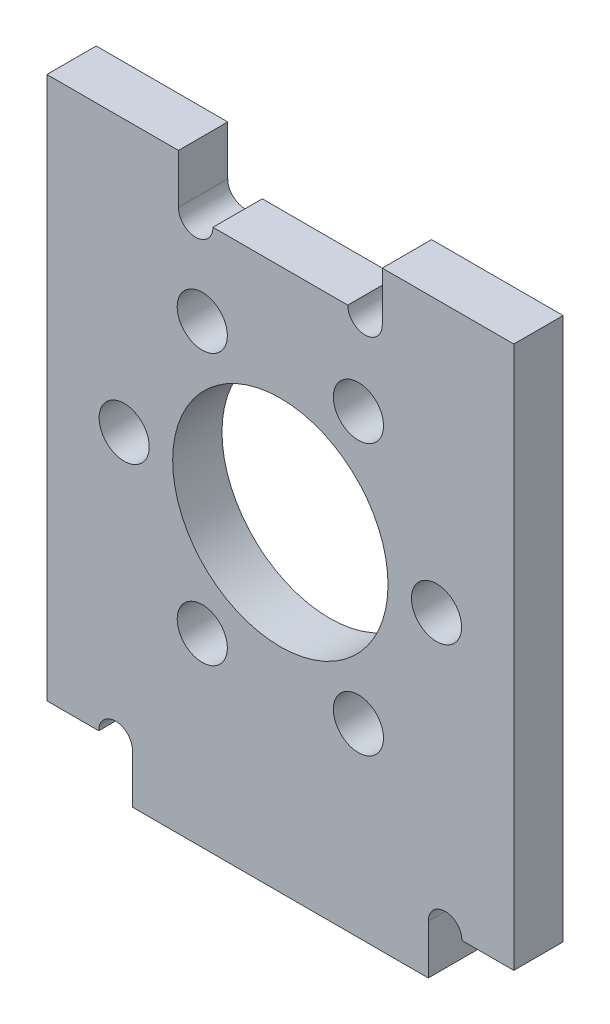
ISO-10303-21;
HEADER;
FILE_DESCRIPTION(('STEP AP214'),'2;1');
FILE_NAME('part.step','',(''),(''),'','','');
FILE_SCHEMA(('AUTOMOTIVE_DESIGN { 1 0 10303 214 1 1 1 1 }'));
ENDSEC;
DATA;
#1=APPLICATION_CONTEXT('core data for automotive mechanical design processes');
#2=APPLICATION_PROTOCOL_DEFINITION('international standard','automotive_design',2000,#1);
#3=PRODUCT_CONTEXT('',#1,'mechanical');
#4=PRODUCT('Part','Part','',(#3));
#5=PRODUCT_RELATED_PRODUCT_CATEGORY('part','',(#4));
#6=PRODUCT_DEFINITION_FORMATION('','',#4);
#7=PRODUCT_DEFINITION_CONTEXT('part definition',#1,'design');
#8=PRODUCT_DEFINITION('design','',#6,#7);
#9=PRODUCT_DEFINITION_SHAPE('','',#8);
#10=(LENGTH_UNIT() NAMED_UNIT(*) SI_UNIT(.MILLI.,.METRE.));
#11=(NAMED_UNIT(*) PLANE_ANGLE_UNIT() SI_UNIT($,.RADIAN.));
#12=(NAMED_UNIT(*) SI_UNIT($,.STERADIAN.) SOLID_ANGLE_UNIT());
#13=UNCERTAINTY_MEASURE_WITH_UNIT(LENGTH_MEASURE(1.E-05),#10,'distance_accuracy_value','');
#14=(GEOMETRIC_REPRESENTATION_CONTEXT(3) GLOBAL_UNCERTAINTY_ASSIGNED_CONTEXT((#13)) GLOBAL_UNIT_ASSIGNED_CONTEXT((#10,
#11,#12)) REPRESENTATION_CONTEXT('',''));
#15=CARTESIAN_POINT('',(0.,0.,0.));
#16=DIRECTION('',(0.,0.,1.));
#17=DIRECTION('',(1.,0.,0.));
#18=AXIS2_PLACEMENT_3D('',#15,#16,#17);
#19=CARTESIAN_POINT('',(-14.2,-15.,3.));
#20=DIRECTION('',(0.,1.,0.));
#21=DIRECTION('',(0.,0.,1.));
#22=AXIS2_PLACEMENT_3D('',#19,#20,#21);
#23=PLANE('',#22);
#24=DIRECTION('',(1.,0.,0.));
#25=VECTOR('',#24,1.);
#26=CARTESIAN_POINT('',(-14.2,-15.,0.));
#27=LINE('',#26,#25);
#28=CARTESIAN_POINT('',(-14.2,-15.,0.));
#29=VERTEX_POINT('',#28);
#30=CARTESIAN_POINT('',(-11.05,-15.,0.));
#31=VERTEX_POINT('',#30);
#32=EDGE_CURVE('E186',#29,#31,#27,.T.);
#33=ORIENTED_EDGE('',*,*,#32,.T.);
#34=DIRECTION('',(0.,0.,-1.));
#35=VECTOR('',#34,1.);
#36=CARTESIAN_POINT('',(-11.05,-15.,5.89913780286485));
#37=LINE('',#36,#35);
#38=CARTESIAN_POINT('',(-11.05,-15.,3.));
#39=VERTEX_POINT('',#38);
#40=EDGE_CURVE('E153',#31,#39,#37,.F.);
#41=ORIENTED_EDGE('',*,*,#40,.T.);
#42=DIRECTION('',(1.,0.,0.));
#43=VECTOR('',#42,1.);
#44=CARTESIAN_POINT('',(-14.2,-15.,3.));
#45=LINE('',#44,#43);
#46=CARTESIAN_POINT('',(-14.2,-15.,3.));
#47=VERTEX_POINT('',#46);
#48=EDGE_CURVE('E170',#47,#39,#45,.T.);
#49=ORIENTED_EDGE('',*,*,#48,.F.);
#50=DIRECTION('',(0.,0.,-1.));
#51=VECTOR('',#50,1.);
#52=CARTESIAN_POINT('',(-14.2,-15.,3.));
#53=LINE('',#52,#51);
#54=EDGE_CURVE('E11',#47,#29,#53,.T.);
#55=ORIENTED_EDGE('',*,*,#54,.T.);
#56=EDGE_LOOP('',(#33,#41,#49,#55));
#57=FACE_BOUND('',#56,.T.);
#58=ADVANCED_FACE('F35',(#57),#23,.F.);
#59=CARTESIAN_POINT('',(14.2,-15.,3.));
#60=DIRECTION('',(-1.,0.,0.));
#61=DIRECTION('',(0.,0.,1.));
#62=AXIS2_PLACEMENT_3D('',#59,#60,#61);
#63=PLANE('',#62);
#64=DIRECTION('',(0.,1.,0.));
#65=VECTOR('',#64,1.);
#66=CARTESIAN_POINT('',(14.2,-15.,0.));
#67=LINE('',#66,#65);
#68=CARTESIAN_POINT('',(14.2,-15.,0.));
#69=VERTEX_POINT('',#68);
#70=CARTESIAN_POINT('',(14.2,18.,0.));
#71=VERTEX_POINT('',#70);
#72=EDGE_CURVE('E177',#69,#71,#67,.T.);
#73=ORIENTED_EDGE('',*,*,#72,.T.);
#74=DIRECTION('',(0.,0.,-1.));
#75=VECTOR('',#74,1.);
#76=CARTESIAN_POINT('',(14.2,18.,11.5440037453175));
#77=LINE('',#76,#75);
#78=CARTESIAN_POINT('',(14.2,18.,3.));
#79=VERTEX_POINT('',#78);
#80=EDGE_CURVE('E214',#79,#71,#77,.T.);
#81=ORIENTED_EDGE('',*,*,#80,.F.);
#82=DIRECTION('',(0.,1.,0.));
#83=VECTOR('',#82,1.);
#84=CARTESIAN_POINT('',(14.2,-15.,3.));
#85=LINE('',#84,#83);
#86=CARTESIAN_POINT('',(14.2,-15.,3.));
#87=VERTEX_POINT('',#86);
#88=EDGE_CURVE('E188',#87,#79,#85,.T.);
#89=ORIENTED_EDGE('',*,*,#88,.F.);
#90=DIRECTION('',(0.,0.,-1.));
#91=VECTOR('',#90,1.);
#92=CARTESIAN_POINT('',(14.2,-15.,3.));
#93=LINE('',#92,#91);
#94=EDGE_CURVE('E43',#87,#69,#93,.T.);
#95=ORIENTED_EDGE('',*,*,#94,.T.);
#96=EDGE_LOOP('',(#73,#81,#89,#95));
#97=FACE_BOUND('',#96,.T.);
#98=ADVANCED_FACE('F37',(#97),#63,.F.);
#99=CARTESIAN_POINT('',(-14.2,15.,3.));
#100=DIRECTION('',(0.,-1.,0.));
#101=DIRECTION('',(0.,0.,-1.));
#102=AXIS2_PLACEMENT_3D('',#99,#100,#101);
#103=PLANE('',#102);
#104=DIRECTION('',(-1.,0.,0.));
#105=VECTOR('',#104,1.);
#106=CARTESIAN_POINT('',(-14.2,15.,0.));
#107=LINE('',#106,#105);
#108=CARTESIAN_POINT('',(4.1,15.,0.));
#109=VERTEX_POINT('',#108);
#110=CARTESIAN_POINT('',(-4.1,15.,0.));
#111=VERTEX_POINT('',#110);
#112=EDGE_CURVE('E179',#109,#111,#107,.T.);
#113=ORIENTED_EDGE('',*,*,#112,.T.);
#114=DIRECTION('',(0.,0.,1.));
#115=VECTOR('',#114,1.);
#116=CARTESIAN_POINT('',(-4.1,15.,-2.9698484809835));
#117=LINE('',#116,#115);
#118=CARTESIAN_POINT('',(-4.1,15.,3.));
#119=VERTEX_POINT('',#118);
#120=EDGE_CURVE('E274',#111,#119,#117,.T.);
#121=ORIENTED_EDGE('',*,*,#120,.T.);
#122=DIRECTION('',(-1.,0.,0.));
#123=VECTOR('',#122,1.);
#124=CARTESIAN_POINT('',(-14.2,15.,3.));
#125=LINE('',#124,#123);
#126=CARTESIAN_POINT('',(4.1,15.,3.));
#127=VERTEX_POINT('',#126);
#128=EDGE_CURVE('E173',#127,#119,#125,.T.);
#129=ORIENTED_EDGE('',*,*,#128,.F.);
#130=DIRECTION('',(0.,0.,1.));
#131=VECTOR('',#130,1.);
#132=CARTESIAN_POINT('',(4.1,15.,-2.9698484809835));
#133=LINE('',#132,#131);
#134=EDGE_CURVE('E272',#127,#109,#133,.F.);
#135=ORIENTED_EDGE('',*,*,#134,.T.);
#136=EDGE_LOOP('',(#113,#121,#129,#135));
#137=FACE_BOUND('',#136,.T.);
#138=ADVANCED_FACE('F271',(#137),#103,.F.);
#139=CARTESIAN_POINT('',(-14.2,-15.,3.));
#140=DIRECTION('',(1.,0.,0.));
#141=DIRECTION('',(0.,0.,-1.));
#142=AXIS2_PLACEMENT_3D('',#139,#140,#141);
#143=PLANE('',#142);
#144=DIRECTION('',(0.,-1.,0.));
#145=VECTOR('',#144,1.);
#146=CARTESIAN_POINT('',(-14.2,-15.,0.));
#147=LINE('',#146,#145);
#148=CARTESIAN_POINT('',(-14.2,18.,0.));
#149=VERTEX_POINT('',#148);
#150=EDGE_CURVE('E183',#149,#29,#147,.T.);
#151=ORIENTED_EDGE('',*,*,#150,.T.);
#152=ORIENTED_EDGE('',*,*,#54,.F.);
#153=DIRECTION('',(0.,-1.,0.));
#154=VECTOR('',#153,1.);
#155=CARTESIAN_POINT('',(-14.2,-15.,3.));
#156=LINE('',#155,#154);
#157=CARTESIAN_POINT('',(-14.2,18.,3.));
#158=VERTEX_POINT('',#157);
#159=EDGE_CURVE('E171',#158,#47,#156,.T.);
#160=ORIENTED_EDGE('',*,*,#159,.F.);
#161=DIRECTION('',(0.,0.,-1.));
#162=VECTOR('',#161,1.);
#163=CARTESIAN_POINT('',(-14.2,18.,11.5440037453175));
#164=LINE('',#163,#162);
#165=EDGE_CURVE('E291',#158,#149,#164,.T.);
#166=ORIENTED_EDGE('',*,*,#165,.T.);
#167=EDGE_LOOP('',(#151,#152,#160,#166));
#168=FACE_BOUND('',#167,.T.);
#169=ADVANCED_FACE('F327',(#168),#143,.F.);
#170=CARTESIAN_POINT('',(11.05,-15.,3.));
#171=VERTEX_POINT('',#170);
#172=EDGE_CURVE('E160',#171,#87,#45,.T.);
#173=ORIENTED_EDGE('',*,*,#172,.F.);
#174=DIRECTION('',(0.,0.,-1.));
#175=VECTOR('',#174,1.);
#176=CARTESIAN_POINT('',(11.05,-15.,5.89913780286485));
#177=LINE('',#176,#175);
#178=CARTESIAN_POINT('',(11.05,-15.,0.));
#179=VERTEX_POINT('',#178);
#180=EDGE_CURVE('E146',#171,#179,#177,.T.);
#181=ORIENTED_EDGE('',*,*,#180,.T.);
#182=EDGE_CURVE('E185',#179,#69,#27,.T.);
#183=ORIENTED_EDGE('',*,*,#182,.T.);
#184=ORIENTED_EDGE('',*,*,#94,.F.);
#185=EDGE_LOOP('',(#173,#181,#183,#184));
#186=FACE_BOUND('',#185,.T.);
#187=ADVANCED_FACE('F167',(#186),#23,.F.);
#188=CARTESIAN_POINT('',(0.,0.,3.));
#189=DIRECTION('',(0.,0.,-1.));
#190=DIRECTION('',(-1.,0.,0.));
#191=AXIS2_PLACEMENT_3D('',#188,#189,#190);
#192=PLANE('',#191);
#193=ORIENTED_EDGE('',*,*,#48,.T.);
#194=CARTESIAN_POINT('',(-10.025,-15.,3.));
#195=DIRECTION('',(0.,0.,-1.));
#196=DIRECTION('',(-1.,0.,0.));
#197=AXIS2_PLACEMENT_3D('',#194,#195,#196);
#198=CIRCLE('',#197,1.025);
#199=CARTESIAN_POINT('',(-8.99999999999999,-15.,3.));
#200=VERTEX_POINT('',#199);
#201=EDGE_CURVE('E154',#200,#39,#198,.F.);
#202=ORIENTED_EDGE('',*,*,#201,.F.);
#203=DIRECTION('',(0.,-1.,0.));
#204=VECTOR('',#203,1.);
#205=CARTESIAN_POINT('',(-8.99999999999999,-18.,3.));
#206=LINE('',#205,#204);
#207=CARTESIAN_POINT('',(-8.99999999999999,-18.,3.));
#208=VERTEX_POINT('',#207);
#209=EDGE_CURVE('E358',#200,#208,#206,.T.);
#210=ORIENTED_EDGE('',*,*,#209,.T.);
#211=DIRECTION('',(1.,0.,0.));
#212=VECTOR('',#211,1.);
#213=CARTESIAN_POINT('',(9.00000000000001,-18.,3.));
#214=LINE('',#213,#212);
#215=CARTESIAN_POINT('',(9.00000000000001,-18.,3.));
#216=VERTEX_POINT('',#215);
#217=EDGE_CURVE('E355',#208,#216,#214,.T.);
#218=ORIENTED_EDGE('',*,*,#217,.T.);
#219=DIRECTION('',(0.,1.,0.));
#220=VECTOR('',#219,1.);
#221=CARTESIAN_POINT('',(9.00000000000001,-18.,3.));
#222=LINE('',#221,#220);
#223=CARTESIAN_POINT('',(9.00000000000001,-15.,3.));
#224=VERTEX_POINT('',#223);
#225=EDGE_CURVE('E163',#216,#224,#222,.T.);
#226=ORIENTED_EDGE('',*,*,#225,.T.);
#227=CARTESIAN_POINT('',(10.025,-15.,3.));
#228=DIRECTION('',(0.,0.,-1.));
#229=DIRECTION('',(-1.,0.,0.));
#230=AXIS2_PLACEMENT_3D('',#227,#228,#229);
#231=CIRCLE('',#230,1.025);
#232=EDGE_CURVE('E50',#171,#224,#231,.F.);
#233=ORIENTED_EDGE('',*,*,#232,.F.);
#234=ORIENTED_EDGE('',*,*,#172,.T.);
#235=ORIENTED_EDGE('',*,*,#88,.T.);
#236=DIRECTION('',(-1.,0.,0.));
#237=VECTOR('',#236,1.);
#238=CARTESIAN_POINT('',(14.2,18.,3.));
#239=LINE('',#238,#237);
#240=CARTESIAN_POINT('',(6.2,18.,3.));
#241=VERTEX_POINT('',#240);
#242=EDGE_CURVE('E243',#79,#241,#239,.T.);
#243=ORIENTED_EDGE('',*,*,#242,.T.);
#244=DIRECTION('',(0.,-1.,0.));
#245=VECTOR('',#244,1.);
#246=CARTESIAN_POINT('',(6.2,15.,3.));
#247=LINE('',#246,#245);
#248=CARTESIAN_POINT('',(6.2,15.,3.));
#249=VERTEX_POINT('',#248);
#250=EDGE_CURVE('E216',#241,#249,#247,.T.);
#251=ORIENTED_EDGE('',*,*,#250,.T.);
#252=CARTESIAN_POINT('',(5.15,15.,3.));
#253=DIRECTION('',(0.,0.,1.));
#254=DIRECTION('',(1.,0.,0.));
#255=AXIS2_PLACEMENT_3D('',#252,#253,#254);
#256=CIRCLE('',#255,1.05);
#257=EDGE_CURVE('E267',#127,#249,#256,.T.);
#258=ORIENTED_EDGE('',*,*,#257,.F.);
#259=ORIENTED_EDGE('',*,*,#128,.T.);
#260=CARTESIAN_POINT('',(-5.15,15.,3.));
#261=DIRECTION('',(0.,0.,1.));
#262=DIRECTION('',(1.,0.,0.));
#263=AXIS2_PLACEMENT_3D('',#260,#261,#262);
#264=CIRCLE('',#263,1.05);
#265=CARTESIAN_POINT('',(-6.2,15.,3.));
#266=VERTEX_POINT('',#265);
#267=EDGE_CURVE('E264',#266,#119,#264,.T.);
#268=ORIENTED_EDGE('',*,*,#267,.F.);
#269=DIRECTION('',(0.,1.,0.));
#270=VECTOR('',#269,1.);
#271=CARTESIAN_POINT('',(-6.2,15.,3.));
#272=LINE('',#271,#270);
#273=CARTESIAN_POINT('',(-6.2,18.,3.));
#274=VERTEX_POINT('',#273);
#275=EDGE_CURVE('E283',#266,#274,#272,.T.);
#276=ORIENTED_EDGE('',*,*,#275,.T.);
#277=DIRECTION('',(-1.,0.,0.));
#278=VECTOR('',#277,1.);
#279=CARTESIAN_POINT('',(-14.2,18.,3.));
#280=LINE('',#279,#278);
#281=EDGE_CURVE('E210',#274,#158,#280,.T.);
#282=ORIENTED_EDGE('',*,*,#281,.T.);
#283=ORIENTED_EDGE('',*,*,#159,.T.);
#284=EDGE_LOOP('',(#193,#202,#210,#218,#226,#233,#234,#235,#243,#251,#258,#259,#268,#276,#282,#283));
#285=FACE_BOUND('',#284,.T.);
#286=CARTESIAN_POINT('',(-4.75000000000023,9.72724133598057,3.));
#287=DIRECTION('',(0.,0.,1.));
#288=DIRECTION('',(0.50000000000001,-0.866025403784433,0.));
#289=AXIS2_PLACEMENT_3D('',#286,#287,#288);
#290=CIRCLE('',#289,1.525);
#291=CARTESIAN_POINT('',(-3.98750000000021,8.40655259520931,3.));
#292=VERTEX_POINT('',#291);
#293=EDGE_CURVE('E240',#292,#292,#290,.T.);
#294=ORIENTED_EDGE('',*,*,#293,.F.);
#295=EDGE_LOOP('',(#294));
#296=FACE_BOUND('',#295,.T.);
#297=CARTESIAN_POINT('',(4.74999999999979,9.72724133598081,3.));
#298=DIRECTION('',(0.,0.,1.));
#299=DIRECTION('',(-0.499999999999992,-0.866025403784443,0.));
#300=AXIS2_PLACEMENT_3D('',#297,#298,#299);
#301=CIRCLE('',#300,1.525);
#302=CARTESIAN_POINT('',(3.9874999999998,8.40655259520954,3.));
#303=VERTEX_POINT('',#302);
#304=EDGE_CURVE('E234',#303,#303,#301,.T.);
#305=ORIENTED_EDGE('',*,*,#304,.F.);
#306=EDGE_LOOP('',(#305));
#307=FACE_BOUND('',#306,.T.);
#308=CARTESIAN_POINT('',(9.5,1.50000000002868,3.));
#309=DIRECTION('',(0.,0.,1.));
#310=DIRECTION('',(-1.,0.,0.));
#311=AXIS2_PLACEMENT_3D('',#308,#309,#310);
#312=CIRCLE('',#311,1.525);
#313=CARTESIAN_POINT('',(7.975,1.50000000002868,3.));
#314=VERTEX_POINT('',#313);
#315=EDGE_CURVE('E228',#314,#314,#312,.T.);
#316=ORIENTED_EDGE('',*,*,#315,.F.);
#317=EDGE_LOOP('',(#316));
#318=FACE_BOUND('',#317,.T.);
#319=CARTESIAN_POINT('',(4.75000000000016,-6.72724133592354,3.));
#320=DIRECTION('',(0.,0.,1.));
#321=DIRECTION('',(-0.500000000000004,0.866025403784436,0.));
#322=AXIS2_PLACEMENT_3D('',#319,#320,#321);
#323=CIRCLE('',#322,1.525);
#324=CARTESIAN_POINT('',(3.98750000000016,-5.40655259515228,3.));
#325=VERTEX_POINT('',#324);
#326=EDGE_CURVE('E222',#325,#325,#323,.T.);
#327=ORIENTED_EDGE('',*,*,#326,.F.);
#328=EDGE_LOOP('',(#327));
#329=FACE_BOUND('',#328,.T.);
#330=CARTESIAN_POINT('',(-4.74999999999986,-6.72724133592372,3.));
#331=DIRECTION('',(0.,0.,1.));
#332=DIRECTION('',(0.499999999999998,0.86602540378444,0.));
#333=AXIS2_PLACEMENT_3D('',#330,#331,#332);
#334=CIRCLE('',#333,1.525);
#335=CARTESIAN_POINT('',(-3.98749999999986,-5.40655259515245,3.));
#336=VERTEX_POINT('',#335);
#337=EDGE_CURVE('E221',#336,#336,#334,.T.);
#338=ORIENTED_EDGE('',*,*,#337,.F.);
#339=EDGE_LOOP('',(#338));
#340=FACE_BOUND('',#339,.T.);
#341=CARTESIAN_POINT('',(-9.5,1.50000000002838,3.));
#342=DIRECTION('',(0.,0.,1.));
#343=DIRECTION('',(1.,0.,0.));
#344=AXIS2_PLACEMENT_3D('',#341,#342,#343);
#345=CIRCLE('',#344,1.525);
#346=CARTESIAN_POINT('',(-7.975,1.50000000002838,3.));
#347=VERTEX_POINT('',#346);
#348=EDGE_CURVE('E247',#347,#347,#345,.T.);
#349=ORIENTED_EDGE('',*,*,#348,.F.);
#350=EDGE_LOOP('',(#349));
#351=FACE_BOUND('',#350,.T.);
#352=CARTESIAN_POINT('',(0.,1.50000000002853,3.));
#353=DIRECTION('',(0.,0.,1.));
#354=DIRECTION('',(1.,0.,0.));
#355=AXIS2_PLACEMENT_3D('',#352,#353,#354);
#356=CIRCLE('',#355,6.55);
#357=CARTESIAN_POINT('',(6.55,1.50000000002853,3.));
#358=VERTEX_POINT('',#357);
#359=EDGE_CURVE('E253',#358,#358,#356,.T.);
#360=ORIENTED_EDGE('',*,*,#359,.F.);
#361=EDGE_LOOP('',(#360));
#362=FACE_BOUND('',#361,.T.);
#363=ADVANCED_FACE('F158',(#285,#296,#307,#318,#329,#340,#351,#362),#192,.F.);
#364=CARTESIAN_POINT('',(0.,0.,0.));
#365=DIRECTION('',(0.,0.,-1.));
#366=DIRECTION('',(-1.,0.,0.));
#367=AXIS2_PLACEMENT_3D('',#364,#365,#366);
#368=PLANE('',#367);
#369=CARTESIAN_POINT('',(-10.025,-15.,0.));
#370=DIRECTION('',(0.,0.,-1.));
#371=DIRECTION('',(-1.,0.,0.));
#372=AXIS2_PLACEMENT_3D('',#369,#370,#371);
#373=CIRCLE('',#372,1.025);
#374=CARTESIAN_POINT('',(-8.99999999999999,-15.,0.));
#375=VERTEX_POINT('',#374);
#376=EDGE_CURVE('E165',#31,#375,#373,.T.);
#377=ORIENTED_EDGE('',*,*,#376,.F.);
#378=ORIENTED_EDGE('',*,*,#32,.F.);
#379=ORIENTED_EDGE('',*,*,#150,.F.);
#380=DIRECTION('',(1.,0.,0.));
#381=VECTOR('',#380,1.);
#382=CARTESIAN_POINT('',(-14.2,18.,0.));
#383=LINE('',#382,#381);
#384=CARTESIAN_POINT('',(-6.2,18.,0.));
#385=VERTEX_POINT('',#384);
#386=EDGE_CURVE('E276',#149,#385,#383,.T.);
#387=ORIENTED_EDGE('',*,*,#386,.T.);
#388=DIRECTION('',(0.,-1.,0.));
#389=VECTOR('',#388,1.);
#390=CARTESIAN_POINT('',(-6.2,15.,0.));
#391=LINE('',#390,#389);
#392=CARTESIAN_POINT('',(-6.2,15.,0.));
#393=VERTEX_POINT('',#392);
#394=EDGE_CURVE('E288',#385,#393,#391,.T.);
#395=ORIENTED_EDGE('',*,*,#394,.T.);
#396=CARTESIAN_POINT('',(-5.15,15.,0.));
#397=DIRECTION('',(0.,0.,-1.));
#398=DIRECTION('',(-1.,0.,0.));
#399=AXIS2_PLACEMENT_3D('',#396,#397,#398);
#400=CIRCLE('',#399,1.05);
#401=EDGE_CURVE('E58',#393,#111,#400,.F.);
#402=ORIENTED_EDGE('',*,*,#401,.T.);
#403=ORIENTED_EDGE('',*,*,#112,.F.);
#404=CARTESIAN_POINT('',(5.15,15.,0.));
#405=DIRECTION('',(0.,0.,-1.));
#406=DIRECTION('',(-1.,0.,0.));
#407=AXIS2_PLACEMENT_3D('',#404,#405,#406);
#408=CIRCLE('',#407,1.05);
#409=CARTESIAN_POINT('',(6.2,15.,0.));
#410=VERTEX_POINT('',#409);
#411=EDGE_CURVE('E280',#109,#410,#408,.F.);
#412=ORIENTED_EDGE('',*,*,#411,.T.);
#413=DIRECTION('',(0.,1.,0.));
#414=VECTOR('',#413,1.);
#415=CARTESIAN_POINT('',(6.2,15.,0.));
#416=LINE('',#415,#414);
#417=CARTESIAN_POINT('',(6.2,18.,0.));
#418=VERTEX_POINT('',#417);
#419=EDGE_CURVE('E203',#410,#418,#416,.T.);
#420=ORIENTED_EDGE('',*,*,#419,.T.);
#421=DIRECTION('',(1.,0.,0.));
#422=VECTOR('',#421,1.);
#423=CARTESIAN_POINT('',(14.2,18.,0.));
#424=LINE('',#423,#422);
#425=EDGE_CURVE('E200',#418,#71,#424,.T.);
#426=ORIENTED_EDGE('',*,*,#425,.T.);
#427=ORIENTED_EDGE('',*,*,#72,.F.);
#428=ORIENTED_EDGE('',*,*,#182,.F.);
#429=CARTESIAN_POINT('',(10.025,-15.,0.));
#430=DIRECTION('',(0.,0.,-1.));
#431=DIRECTION('',(-1.,0.,0.));
#432=AXIS2_PLACEMENT_3D('',#429,#430,#431);
#433=CIRCLE('',#432,1.025);
#434=CARTESIAN_POINT('',(9.00000000000001,-15.,0.));
#435=VERTEX_POINT('',#434);
#436=EDGE_CURVE('E149',#435,#179,#433,.T.);
#437=ORIENTED_EDGE('',*,*,#436,.F.);
#438=DIRECTION('',(0.,-1.,0.));
#439=VECTOR('',#438,1.);
#440=CARTESIAN_POINT('',(9.00000000000001,-18.,0.));
#441=LINE('',#440,#439);
#442=CARTESIAN_POINT('',(9.00000000000001,-18.,0.));
#443=VERTEX_POINT('',#442);
#444=EDGE_CURVE('E362',#435,#443,#441,.T.);
#445=ORIENTED_EDGE('',*,*,#444,.T.);
#446=DIRECTION('',(-1.,0.,0.));
#447=VECTOR('',#446,1.);
#448=CARTESIAN_POINT('',(9.00000000000001,-18.,0.));
#449=LINE('',#448,#447);
#450=CARTESIAN_POINT('',(-8.99999999999999,-18.,0.));
#451=VERTEX_POINT('',#450);
#452=EDGE_CURVE('E364',#443,#451,#449,.T.);
#453=ORIENTED_EDGE('',*,*,#452,.T.);
#454=DIRECTION('',(0.,1.,0.));
#455=VECTOR('',#454,1.);
#456=CARTESIAN_POINT('',(-8.99999999999999,-18.,0.));
#457=LINE('',#456,#455);
#458=EDGE_CURVE('E346',#451,#375,#457,.T.);
#459=ORIENTED_EDGE('',*,*,#458,.T.);
#460=EDGE_LOOP('',(#377,#378,#379,#387,#395,#402,#403,#412,#420,#426,#427,#428,#437,#445,#453,#459));
#461=FACE_BOUND('',#460,.T.);
#462=CARTESIAN_POINT('',(-4.75000000000023,9.72724133598057,0.));
#463=DIRECTION('',(0.,0.,1.));
#464=DIRECTION('',(0.50000000000001,-0.866025403784433,0.));
#465=AXIS2_PLACEMENT_3D('',#462,#463,#464);
#466=CIRCLE('',#465,1.525);
#467=CARTESIAN_POINT('',(-3.98750000000021,8.40655259520931,0.));
#468=VERTEX_POINT('',#467);
#469=EDGE_CURVE('E237',#468,#468,#466,.T.);
#470=ORIENTED_EDGE('',*,*,#469,.T.);
#471=EDGE_LOOP('',(#470));
#472=FACE_BOUND('',#471,.T.);
#473=CARTESIAN_POINT('',(4.74999999999979,9.72724133598081,0.));
#474=DIRECTION('',(0.,0.,1.));
#475=DIRECTION('',(-0.499999999999992,-0.866025403784443,0.));
#476=AXIS2_PLACEMENT_3D('',#473,#474,#475);
#477=CIRCLE('',#476,1.525);
#478=CARTESIAN_POINT('',(3.9874999999998,8.40655259520954,0.));
#479=VERTEX_POINT('',#478);
#480=EDGE_CURVE('E231',#479,#479,#477,.T.);
#481=ORIENTED_EDGE('',*,*,#480,.T.);
#482=EDGE_LOOP('',(#481));
#483=FACE_BOUND('',#482,.T.);
#484=CARTESIAN_POINT('',(9.5,1.50000000002868,0.));
#485=DIRECTION('',(0.,0.,1.));
#486=DIRECTION('',(-1.,0.,0.));
#487=AXIS2_PLACEMENT_3D('',#484,#485,#486);
#488=CIRCLE('',#487,1.525);
#489=CARTESIAN_POINT('',(7.975,1.50000000002868,0.));
#490=VERTEX_POINT('',#489);
#491=EDGE_CURVE('E225',#490,#490,#488,.T.);
#492=ORIENTED_EDGE('',*,*,#491,.T.);
#493=EDGE_LOOP('',(#492));
#494=FACE_BOUND('',#493,.T.);
#495=CARTESIAN_POINT('',(4.75000000000016,-6.72724133592354,0.));
#496=DIRECTION('',(0.,0.,1.));
#497=DIRECTION('',(-0.500000000000004,0.866025403784436,0.));
#498=AXIS2_PLACEMENT_3D('',#495,#496,#497);
#499=CIRCLE('',#498,1.525);
#500=CARTESIAN_POINT('',(3.98750000000016,-5.40655259515228,0.));
#501=VERTEX_POINT('',#500);
#502=EDGE_CURVE('E218',#501,#501,#499,.T.);
#503=ORIENTED_EDGE('',*,*,#502,.T.);
#504=EDGE_LOOP('',(#503));
#505=FACE_BOUND('',#504,.T.);
#506=CARTESIAN_POINT('',(-4.74999999999986,-6.72724133592372,0.));
#507=DIRECTION('',(0.,0.,1.));
#508=DIRECTION('',(0.499999999999998,0.86602540378444,0.));
#509=AXIS2_PLACEMENT_3D('',#506,#507,#508);
#510=CIRCLE('',#509,1.525);
#511=CARTESIAN_POINT('',(-3.98749999999986,-5.40655259515245,0.));
#512=VERTEX_POINT('',#511);
#513=EDGE_CURVE('E244',#512,#512,#510,.T.);
#514=ORIENTED_EDGE('',*,*,#513,.T.);
#515=EDGE_LOOP('',(#514));
#516=FACE_BOUND('',#515,.T.);
#517=CARTESIAN_POINT('',(-9.5,1.50000000002838,0.));
#518=DIRECTION('',(0.,0.,1.));
#519=DIRECTION('',(1.,0.,0.));
#520=AXIS2_PLACEMENT_3D('',#517,#518,#519);
#521=CIRCLE('',#520,1.525);
#522=CARTESIAN_POINT('',(-7.975,1.50000000002838,0.));
#523=VERTEX_POINT('',#522);
#524=EDGE_CURVE('E250',#523,#523,#521,.T.);
#525=ORIENTED_EDGE('',*,*,#524,.T.);
#526=EDGE_LOOP('',(#525));
#527=FACE_BOUND('',#526,.T.);
#528=CARTESIAN_POINT('',(0.,1.50000000002853,0.));
#529=DIRECTION('',(0.,0.,1.));
#530=DIRECTION('',(1.,0.,0.));
#531=AXIS2_PLACEMENT_3D('',#528,#529,#530);
#532=CIRCLE('',#531,6.55);
#533=CARTESIAN_POINT('',(6.55,1.50000000002853,0.));
#534=VERTEX_POINT('',#533);
#535=EDGE_CURVE('E180',#534,#534,#532,.T.);
#536=ORIENTED_EDGE('',*,*,#535,.T.);
#537=EDGE_LOOP('',(#536));
#538=FACE_BOUND('',#537,.T.);
#539=ADVANCED_FACE('F196',(#461,#472,#483,#494,#505,#516,#527,#538),#368,.T.);
#540=CARTESIAN_POINT('',(0.,1.50000000002853,0.));
#541=DIRECTION('',(0.,0.,1.));
#542=DIRECTION('',(1.,0.,0.));
#543=AXIS2_PLACEMENT_3D('',#540,#541,#542);
#544=CYLINDRICAL_SURFACE('',#543,6.55);
#545=ORIENTED_EDGE('',*,*,#535,.F.);
#546=EDGE_LOOP('',(#545));
#547=FACE_BOUND('',#546,.T.);
#548=ORIENTED_EDGE('',*,*,#359,.T.);
#549=EDGE_LOOP('',(#548));
#550=FACE_BOUND('',#549,.T.);
#551=ADVANCED_FACE('F459',(#547,#550),#544,.F.);
#552=CARTESIAN_POINT('',(-9.5,1.50000000002838,0.));
#553=DIRECTION('',(0.,0.,1.));
#554=DIRECTION('',(1.,0.,0.));
#555=AXIS2_PLACEMENT_3D('',#552,#553,#554);
#556=CYLINDRICAL_SURFACE('',#555,1.525);
#557=ORIENTED_EDGE('',*,*,#524,.F.);
#558=EDGE_LOOP('',(#557));
#559=FACE_BOUND('',#558,.T.);
#560=ORIENTED_EDGE('',*,*,#348,.T.);
#561=EDGE_LOOP('',(#560));
#562=FACE_BOUND('',#561,.T.);
#563=ADVANCED_FACE('F476',(#559,#562),#556,.F.);
#564=CARTESIAN_POINT('',(-4.74999999999986,-6.72724133592372,0.));
#565=DIRECTION('',(0.,0.,1.));
#566=DIRECTION('',(1.,0.,0.));
#567=AXIS2_PLACEMENT_3D('',#564,#565,#566);
#568=CYLINDRICAL_SURFACE('',#567,1.525);
#569=ORIENTED_EDGE('',*,*,#513,.F.);
#570=EDGE_LOOP('',(#569));
#571=FACE_BOUND('',#570,.T.);
#572=ORIENTED_EDGE('',*,*,#337,.T.);
#573=EDGE_LOOP('',(#572));
#574=FACE_BOUND('',#573,.T.);
#575=ADVANCED_FACE('F484',(#571,#574),#568,.F.);
#576=CARTESIAN_POINT('',(4.75000000000016,-6.72724133592354,0.));
#577=DIRECTION('',(0.,0.,1.));
#578=DIRECTION('',(1.,0.,0.));
#579=AXIS2_PLACEMENT_3D('',#576,#577,#578);
#580=CYLINDRICAL_SURFACE('',#579,1.525);
#581=ORIENTED_EDGE('',*,*,#502,.F.);
#582=EDGE_LOOP('',(#581));
#583=FACE_BOUND('',#582,.T.);
#584=ORIENTED_EDGE('',*,*,#326,.T.);
#585=EDGE_LOOP('',(#584));
#586=FACE_BOUND('',#585,.T.);
#587=ADVANCED_FACE('F492',(#583,#586),#580,.F.);
#588=CARTESIAN_POINT('',(9.5,1.50000000002868,0.));
#589=DIRECTION('',(0.,0.,1.));
#590=DIRECTION('',(1.,0.,0.));
#591=AXIS2_PLACEMENT_3D('',#588,#589,#590);
#592=CYLINDRICAL_SURFACE('',#591,1.525);
#593=ORIENTED_EDGE('',*,*,#491,.F.);
#594=EDGE_LOOP('',(#593));
#595=FACE_BOUND('',#594,.T.);
#596=ORIENTED_EDGE('',*,*,#315,.T.);
#597=EDGE_LOOP('',(#596));
#598=FACE_BOUND('',#597,.T.);
#599=ADVANCED_FACE('F500',(#595,#598),#592,.F.);
#600=CARTESIAN_POINT('',(4.74999999999979,9.72724133598081,0.));
#601=DIRECTION('',(0.,0.,1.));
#602=DIRECTION('',(1.,0.,0.));
#603=AXIS2_PLACEMENT_3D('',#600,#601,#602);
#604=CYLINDRICAL_SURFACE('',#603,1.525);
#605=ORIENTED_EDGE('',*,*,#480,.F.);
#606=EDGE_LOOP('',(#605));
#607=FACE_BOUND('',#606,.T.);
#608=ORIENTED_EDGE('',*,*,#304,.T.);
#609=EDGE_LOOP('',(#608));
#610=FACE_BOUND('',#609,.T.);
#611=ADVANCED_FACE('F314',(#607,#610),#604,.F.);
#612=CARTESIAN_POINT('',(-4.75000000000023,9.72724133598057,0.));
#613=DIRECTION('',(0.,0.,1.));
#614=DIRECTION('',(1.,0.,0.));
#615=AXIS2_PLACEMENT_3D('',#612,#613,#614);
#616=CYLINDRICAL_SURFACE('',#615,1.525);
#617=ORIENTED_EDGE('',*,*,#469,.F.);
#618=EDGE_LOOP('',(#617));
#619=FACE_BOUND('',#618,.T.);
#620=ORIENTED_EDGE('',*,*,#293,.T.);
#621=EDGE_LOOP('',(#620));
#622=FACE_BOUND('',#621,.T.);
#623=ADVANCED_FACE('F306',(#619,#622),#616,.F.);
#624=CARTESIAN_POINT('',(14.2,18.,11.5440037453175));
#625=DIRECTION('',(0.,1.,0.));
#626=DIRECTION('',(0.,0.,1.));
#627=AXIS2_PLACEMENT_3D('',#624,#625,#626);
#628=PLANE('',#627);
#629=ORIENTED_EDGE('',*,*,#242,.F.);
#630=ORIENTED_EDGE('',*,*,#80,.T.);
#631=ORIENTED_EDGE('',*,*,#425,.F.);
#632=DIRECTION('',(0.,0.,-1.));
#633=VECTOR('',#632,1.);
#634=CARTESIAN_POINT('',(6.2,18.,11.5440037453175));
#635=LINE('',#634,#633);
#636=EDGE_CURVE('E208',#241,#418,#635,.T.);
#637=ORIENTED_EDGE('',*,*,#636,.F.);
#638=EDGE_LOOP('',(#629,#630,#631,#637));
#639=FACE_BOUND('',#638,.T.);
#640=ADVANCED_FACE('F304',(#639),#628,.T.);
#641=CARTESIAN_POINT('',(6.2,15.,11.5440037453175));
#642=DIRECTION('',(-1.,0.,0.));
#643=DIRECTION('',(0.,0.,1.));
#644=AXIS2_PLACEMENT_3D('',#641,#642,#643);
#645=PLANE('',#644);
#646=ORIENTED_EDGE('',*,*,#250,.F.);
#647=ORIENTED_EDGE('',*,*,#636,.T.);
#648=ORIENTED_EDGE('',*,*,#419,.F.);
#649=DIRECTION('',(0.,0.,-1.));
#650=VECTOR('',#649,1.);
#651=CARTESIAN_POINT('',(6.2,15.,11.5440037453175));
#652=LINE('',#651,#650);
#653=EDGE_CURVE('E206',#249,#410,#652,.T.);
#654=ORIENTED_EDGE('',*,*,#653,.F.);
#655=EDGE_LOOP('',(#646,#647,#648,#654));
#656=FACE_BOUND('',#655,.T.);
#657=ADVANCED_FACE('F303',(#656),#645,.T.);
#658=CARTESIAN_POINT('',(-6.2,15.,11.5440037453175));
#659=DIRECTION('',(1.,0.,0.));
#660=DIRECTION('',(0.,0.,-1.));
#661=AXIS2_PLACEMENT_3D('',#658,#659,#660);
#662=PLANE('',#661);
#663=ORIENTED_EDGE('',*,*,#275,.F.);
#664=DIRECTION('',(0.,0.,-1.));
#665=VECTOR('',#664,1.);
#666=CARTESIAN_POINT('',(-6.2,15.,11.5440037453175));
#667=LINE('',#666,#665);
#668=EDGE_CURVE('E285',#266,#393,#667,.T.);
#669=ORIENTED_EDGE('',*,*,#668,.T.);
#670=ORIENTED_EDGE('',*,*,#394,.F.);
#671=DIRECTION('',(0.,0.,-1.));
#672=VECTOR('',#671,1.);
#673=CARTESIAN_POINT('',(-6.2,18.,11.5440037453175));
#674=LINE('',#673,#672);
#675=EDGE_CURVE('E293',#274,#385,#674,.T.);
#676=ORIENTED_EDGE('',*,*,#675,.F.);
#677=EDGE_LOOP('',(#663,#669,#670,#676));
#678=FACE_BOUND('',#677,.T.);
#679=ADVANCED_FACE('F312',(#678),#662,.T.);
#680=CARTESIAN_POINT('',(-14.2,18.,11.5440037453175));
#681=DIRECTION('',(0.,1.,0.));
#682=DIRECTION('',(0.,0.,1.));
#683=AXIS2_PLACEMENT_3D('',#680,#681,#682);
#684=PLANE('',#683);
#685=ORIENTED_EDGE('',*,*,#281,.F.);
#686=ORIENTED_EDGE('',*,*,#675,.T.);
#687=ORIENTED_EDGE('',*,*,#386,.F.);
#688=ORIENTED_EDGE('',*,*,#165,.F.);
#689=EDGE_LOOP('',(#685,#686,#687,#688));
#690=FACE_BOUND('',#689,.T.);
#691=ADVANCED_FACE('F386',(#690),#684,.T.);
#692=CARTESIAN_POINT('',(-5.15,15.,-2.9698484809835));
#693=DIRECTION('',(0.,0.,1.));
#694=DIRECTION('',(1.,0.,0.));
#695=AXIS2_PLACEMENT_3D('',#692,#693,#694);
#696=CYLINDRICAL_SURFACE('',#695,1.05);
#697=ORIENTED_EDGE('',*,*,#401,.F.);
#698=ORIENTED_EDGE('',*,*,#668,.F.);
#699=ORIENTED_EDGE('',*,*,#267,.T.);
#700=ORIENTED_EDGE('',*,*,#120,.F.);
#701=EDGE_LOOP('',(#697,#698,#699,#700));
#702=FACE_BOUND('',#701,.T.);
#703=ADVANCED_FACE('F377',(#702),#696,.F.);
#704=CARTESIAN_POINT('',(5.15,15.,-2.9698484809835));
#705=DIRECTION('',(0.,0.,1.));
#706=DIRECTION('',(1.,0.,0.));
#707=AXIS2_PLACEMENT_3D('',#704,#705,#706);
#708=CYLINDRICAL_SURFACE('',#707,1.05);
#709=ORIENTED_EDGE('',*,*,#257,.T.);
#710=ORIENTED_EDGE('',*,*,#653,.T.);
#711=ORIENTED_EDGE('',*,*,#411,.F.);
#712=ORIENTED_EDGE('',*,*,#134,.F.);
#713=EDGE_LOOP('',(#709,#710,#711,#712));
#714=FACE_BOUND('',#713,.T.);
#715=ADVANCED_FACE('F374',(#714),#708,.F.);
#716=CARTESIAN_POINT('',(-8.99999999999999,-18.,21.9736659610103));
#717=DIRECTION('',(-1.,0.,0.));
#718=DIRECTION('',(0.,-1.,0.));
#719=AXIS2_PLACEMENT_3D('',#716,#717,#718);
#720=PLANE('',#719);
#721=DIRECTION('',(0.,0.,1.));
#722=VECTOR('',#721,1.);
#723=CARTESIAN_POINT('',(-8.99999999999999,-15.,3.));
#724=LINE('',#723,#722);
#725=EDGE_CURVE('E371',#375,#200,#724,.T.);
#726=ORIENTED_EDGE('',*,*,#725,.F.);
#727=ORIENTED_EDGE('',*,*,#458,.F.);
#728=DIRECTION('',(0.,0.,-1.));
#729=VECTOR('',#728,1.);
#730=CARTESIAN_POINT('',(-8.99999999999999,-18.,21.9736659610103));
#731=LINE('',#730,#729);
#732=EDGE_CURVE('E356',#208,#451,#731,.T.);
#733=ORIENTED_EDGE('',*,*,#732,.F.);
#734=ORIENTED_EDGE('',*,*,#209,.F.);
#735=EDGE_LOOP('',(#726,#727,#733,#734));
#736=FACE_BOUND('',#735,.T.);
#737=ADVANCED_FACE('F376',(#736),#720,.T.);
#738=CARTESIAN_POINT('',(9.00000000000001,-18.,21.9736659610103));
#739=DIRECTION('',(1.,0.,0.));
#740=DIRECTION('',(0.,1.,0.));
#741=AXIS2_PLACEMENT_3D('',#738,#739,#740);
#742=PLANE('',#741);
#743=DIRECTION('',(0.,0.,-1.));
#744=VECTOR('',#743,1.);
#745=CARTESIAN_POINT('',(9.00000000000001,-15.,3.));
#746=LINE('',#745,#744);
#747=EDGE_CURVE('E360',#224,#435,#746,.T.);
#748=ORIENTED_EDGE('',*,*,#747,.F.);
#749=ORIENTED_EDGE('',*,*,#225,.F.);
#750=DIRECTION('',(0.,0.,-1.));
#751=VECTOR('',#750,1.);
#752=CARTESIAN_POINT('',(9.00000000000001,-18.,21.9736659610103));
#753=LINE('',#752,#751);
#754=EDGE_CURVE('E366',#216,#443,#753,.T.);
#755=ORIENTED_EDGE('',*,*,#754,.T.);
#756=ORIENTED_EDGE('',*,*,#444,.F.);
#757=EDGE_LOOP('',(#748,#749,#755,#756));
#758=FACE_BOUND('',#757,.T.);
#759=ADVANCED_FACE('F383',(#758),#742,.T.);
#760=CARTESIAN_POINT('',(9.00000000000001,-18.,21.9736659610103));
#761=DIRECTION('',(0.,-1.,0.));
#762=DIRECTION('',(0.,0.,-1.));
#763=AXIS2_PLACEMENT_3D('',#760,#761,#762);
#764=PLANE('',#763);
#765=ORIENTED_EDGE('',*,*,#217,.F.);
#766=ORIENTED_EDGE('',*,*,#732,.T.);
#767=ORIENTED_EDGE('',*,*,#452,.F.);
#768=ORIENTED_EDGE('',*,*,#754,.F.);
#769=EDGE_LOOP('',(#765,#766,#767,#768));
#770=FACE_BOUND('',#769,.T.);
#771=ADVANCED_FACE('F404',(#770),#764,.T.);
#772=CARTESIAN_POINT('',(10.025,-15.,5.89913780286485));
#773=DIRECTION('',(0.,0.,-1.));
#774=DIRECTION('',(-1.,0.,0.));
#775=AXIS2_PLACEMENT_3D('',#772,#773,#774);
#776=CYLINDRICAL_SURFACE('',#775,1.025);
#777=ORIENTED_EDGE('',*,*,#232,.T.);
#778=ORIENTED_EDGE('',*,*,#747,.T.);
#779=ORIENTED_EDGE('',*,*,#436,.T.);
#780=ORIENTED_EDGE('',*,*,#180,.F.);
#781=EDGE_LOOP('',(#777,#778,#779,#780));
#782=FACE_BOUND('',#781,.T.);
#783=ADVANCED_FACE('F147',(#782),#776,.F.);
#784=CARTESIAN_POINT('',(-10.025,-15.,5.89913780286485));
#785=DIRECTION('',(0.,0.,-1.));
#786=DIRECTION('',(-1.,0.,0.));
#787=AXIS2_PLACEMENT_3D('',#784,#785,#786);
#788=CYLINDRICAL_SURFACE('',#787,1.025);
#789=ORIENTED_EDGE('',*,*,#376,.T.);
#790=ORIENTED_EDGE('',*,*,#725,.T.);
#791=ORIENTED_EDGE('',*,*,#201,.T.);
#792=ORIENTED_EDGE('',*,*,#40,.F.);
#793=EDGE_LOOP('',(#789,#790,#791,#792));
#794=FACE_BOUND('',#793,.T.);
#795=ADVANCED_FACE('F417',(#794),#788,.F.);
#796=CLOSED_SHELL('',(#58,#98,#138,#169,#187,#363,#539,#551,#563,#575,#587,#599,#611,#623,#640,
#657,#679,#691,#703,#715,#737,#759,#771,#783,#795));
#797=MANIFOLD_SOLID_BREP('B2',#796);
#798=ADVANCED_BREP_SHAPE_REPRESENTATION('',(#18,#797),#14);
#799=SHAPE_DEFINITION_REPRESENTATION(#9,#798);
ENDSEC;
END-ISO-10303-21;
